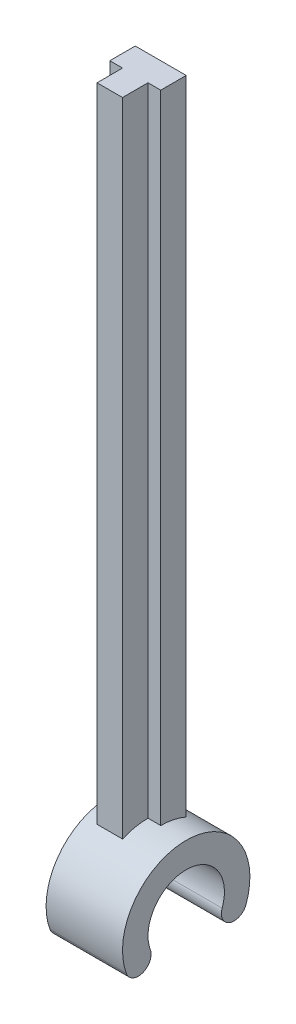
ISO-10303-21;
HEADER;
FILE_DESCRIPTION(('STEP AP214'),'2;1');
FILE_NAME('part.step','',(''),(''),'','','');
FILE_SCHEMA(('AUTOMOTIVE_DESIGN { 1 0 10303 214 1 1 1 1 }'));
ENDSEC;
DATA;
#1=APPLICATION_CONTEXT('core data for automotive mechanical design processes');
#2=APPLICATION_PROTOCOL_DEFINITION('international standard','automotive_design',2000,#1);
#3=PRODUCT_CONTEXT('',#1,'mechanical');
#4=PRODUCT('Part','Part','',(#3));
#5=PRODUCT_RELATED_PRODUCT_CATEGORY('part','',(#4));
#6=PRODUCT_DEFINITION_FORMATION('','',#4);
#7=PRODUCT_DEFINITION_CONTEXT('part definition',#1,'design');
#8=PRODUCT_DEFINITION('design','',#6,#7);
#9=PRODUCT_DEFINITION_SHAPE('','',#8);
#10=(LENGTH_UNIT() NAMED_UNIT(*) SI_UNIT(.MILLI.,.METRE.));
#11=(NAMED_UNIT(*) PLANE_ANGLE_UNIT() SI_UNIT($,.RADIAN.));
#12=(NAMED_UNIT(*) SI_UNIT($,.STERADIAN.) SOLID_ANGLE_UNIT());
#13=UNCERTAINTY_MEASURE_WITH_UNIT(LENGTH_MEASURE(1.E-05),#10,'distance_accuracy_value','');
#14=(GEOMETRIC_REPRESENTATION_CONTEXT(3) GLOBAL_UNCERTAINTY_ASSIGNED_CONTEXT((#13)) GLOBAL_UNIT_ASSIGNED_CONTEXT((#10,
#11,#12)) REPRESENTATION_CONTEXT('',''));
#15=CARTESIAN_POINT('',(0.,0.,0.));
#16=DIRECTION('',(0.,0.,1.));
#17=DIRECTION('',(1.,0.,0.));
#18=AXIS2_PLACEMENT_3D('',#15,#16,#17);
#19=CARTESIAN_POINT('',(4.,0.,0.));
#20=DIRECTION('',(-1.,0.,0.));
#21=DIRECTION('',(0.,0.,1.));
#22=AXIS2_PLACEMENT_3D('',#19,#20,#21);
#23=CYLINDRICAL_SURFACE('',#22,5.);
#24=CARTESIAN_POINT('',(-1.,0.,0.));
#25=DIRECTION('',(1.,0.,0.));
#26=DIRECTION('',(0.,0.,-1.));
#27=AXIS2_PLACEMENT_3D('',#24,#25,#26);
#28=CIRCLE('',#27,5.);
#29=CARTESIAN_POINT('',(-1.,5.,0.));
#30=VERTEX_POINT('',#29);
#31=CARTESIAN_POINT('',(-1.,4.58257569495584,2.));
#32=VERTEX_POINT('',#31);
#33=EDGE_CURVE('E169',#30,#32,#28,.T.);
#34=ORIENTED_EDGE('',*,*,#33,.F.);
#35=DIRECTION('',(-1.,0.,0.));
#36=VECTOR('',#35,1.);
#37=CARTESIAN_POINT('',(4.,5.,0.));
#38=LINE('',#37,#36);
#39=CARTESIAN_POINT('',(-2.,5.,0.));
#40=VERTEX_POINT('',#39);
#41=EDGE_CURVE('E204',#30,#40,#38,.T.);
#42=ORIENTED_EDGE('',*,*,#41,.T.);
#43=CARTESIAN_POINT('',(-2.,0.,0.));
#44=DIRECTION('',(1.,0.,0.));
#45=DIRECTION('',(0.,0.,-1.));
#46=AXIS2_PLACEMENT_3D('',#43,#44,#45);
#47=CIRCLE('',#46,5.);
#48=CARTESIAN_POINT('',(-2.,-1.71010071662835,4.69846310392954));
#49=VERTEX_POINT('',#48);
#50=EDGE_CURVE('E216',#40,#49,#47,.T.);
#51=ORIENTED_EDGE('',*,*,#50,.T.);
#52=DIRECTION('',(-1.,0.,0.));
#53=VECTOR('',#52,1.);
#54=CARTESIAN_POINT('',(4.,-1.71010071662835,4.69846310392954));
#55=LINE('',#54,#53);
#56=CARTESIAN_POINT('',(4.,-1.71010071662835,4.69846310392954));
#57=VERTEX_POINT('',#56);
#58=EDGE_CURVE('E243',#57,#49,#55,.T.);
#59=ORIENTED_EDGE('',*,*,#58,.F.);
#60=CARTESIAN_POINT('',(4.,0.,0.));
#61=DIRECTION('',(1.,0.,0.));
#62=DIRECTION('',(0.,0.,-1.));
#63=AXIS2_PLACEMENT_3D('',#60,#61,#62);
#64=CIRCLE('',#63,5.);
#65=CARTESIAN_POINT('',(4.,-1.71010071662835,-4.69846310392954));
#66=VERTEX_POINT('',#65);
#67=EDGE_CURVE('E233',#66,#57,#64,.T.);
#68=ORIENTED_EDGE('',*,*,#67,.F.);
#69=DIRECTION('',(-1.,0.,0.));
#70=VECTOR('',#69,1.);
#71=CARTESIAN_POINT('',(4.,-1.71010071662835,-4.69846310392954));
#72=LINE('',#71,#70);
#73=CARTESIAN_POINT('',(-2.,-1.71010071662835,-4.69846310392954));
#74=VERTEX_POINT('',#73);
#75=EDGE_CURVE('E247',#66,#74,#72,.T.);
#76=ORIENTED_EDGE('',*,*,#75,.T.);
#77=CARTESIAN_POINT('',(-2.,4.58257569495584,-2.));
#78=VERTEX_POINT('',#77);
#79=EDGE_CURVE('E217',#74,#78,#47,.T.);
#80=ORIENTED_EDGE('',*,*,#79,.T.);
#81=DIRECTION('',(-1.,0.,0.));
#82=VECTOR('',#81,1.);
#83=CARTESIAN_POINT('',(4.,4.58257569495584,-2.));
#84=LINE('',#83,#82);
#85=CARTESIAN_POINT('',(2.,4.58257569495584,-2.));
#86=VERTEX_POINT('',#85);
#87=EDGE_CURVE('E196',#78,#86,#84,.F.);
#88=ORIENTED_EDGE('',*,*,#87,.T.);
#89=CARTESIAN_POINT('',(2.,0.,0.));
#90=DIRECTION('',(1.,0.,0.));
#91=DIRECTION('',(0.,0.,-1.));
#92=AXIS2_PLACEMENT_3D('',#89,#90,#91);
#93=CIRCLE('',#92,5.);
#94=CARTESIAN_POINT('',(2.,5.,0.));
#95=VERTEX_POINT('',#94);
#96=EDGE_CURVE('E52',#86,#95,#93,.T.);
#97=ORIENTED_EDGE('',*,*,#96,.T.);
#98=CARTESIAN_POINT('',(1.,5.,0.));
#99=VERTEX_POINT('',#98);
#100=EDGE_CURVE('E205',#95,#99,#38,.T.);
#101=ORIENTED_EDGE('',*,*,#100,.T.);
#102=CARTESIAN_POINT('',(1.,0.,0.));
#103=DIRECTION('',(1.,0.,0.));
#104=DIRECTION('',(0.,0.,-1.));
#105=AXIS2_PLACEMENT_3D('',#102,#103,#104);
#106=CIRCLE('',#105,5.);
#107=CARTESIAN_POINT('',(1.,4.58257569495584,2.));
#108=VERTEX_POINT('',#107);
#109=EDGE_CURVE('E141',#99,#108,#106,.T.);
#110=ORIENTED_EDGE('',*,*,#109,.T.);
#111=DIRECTION('',(-1.,0.,0.));
#112=VECTOR('',#111,1.);
#113=CARTESIAN_POINT('',(4.,4.58257569495584,2.));
#114=LINE('',#113,#112);
#115=EDGE_CURVE('E11',#108,#32,#114,.T.);
#116=ORIENTED_EDGE('',*,*,#115,.T.);
#117=EDGE_LOOP('',(#34,#42,#51,#59,#68,#76,#80,#88,#97,#101,#110,#116));
#118=FACE_BOUND('',#117,.T.);
#119=ADVANCED_FACE('F43',(#118),#23,.T.);
#120=CARTESIAN_POINT('',(-2.,0.,0.));
#121=DIRECTION('',(0.,0.,1.));
#122=DIRECTION('',(0.,-1.,0.));
#123=AXIS2_PLACEMENT_3D('',#120,#121,#122);
#124=PLANE('',#123);
#125=ORIENTED_EDGE('',*,*,#41,.F.);
#126=DIRECTION('',(0.,1.,0.));
#127=VECTOR('',#126,1.);
#128=CARTESIAN_POINT('',(-1.,3.,0.));
#129=LINE('',#128,#127);
#130=CARTESIAN_POINT('',(-1.,55.,0.));
#131=VERTEX_POINT('',#130);
#132=EDGE_CURVE('E156',#30,#131,#129,.T.);
#133=ORIENTED_EDGE('',*,*,#132,.T.);
#134=DIRECTION('',(1.,0.,0.));
#135=VECTOR('',#134,1.);
#136=CARTESIAN_POINT('',(-2.,55.,0.));
#137=LINE('',#136,#135);
#138=CARTESIAN_POINT('',(-2.,55.,0.));
#139=VERTEX_POINT('',#138);
#140=EDGE_CURVE('E193',#139,#131,#137,.T.);
#141=ORIENTED_EDGE('',*,*,#140,.F.);
#142=DIRECTION('',(0.,-1.,0.));
#143=VECTOR('',#142,1.);
#144=CARTESIAN_POINT('',(-2.,0.,0.));
#145=LINE('',#144,#143);
#146=EDGE_CURVE('E188',#139,#40,#145,.T.);
#147=ORIENTED_EDGE('',*,*,#146,.T.);
#148=EDGE_LOOP('',(#125,#133,#141,#147));
#149=FACE_BOUND('',#148,.T.);
#150=ADVANCED_FACE('F270',(#149),#124,.T.);
#151=CARTESIAN_POINT('',(4.,0.,0.));
#152=DIRECTION('',(-1.,0.,0.));
#153=DIRECTION('',(0.,0.,1.));
#154=AXIS2_PLACEMENT_3D('',#151,#152,#153);
#155=CYLINDRICAL_SURFACE('',#154,3.);
#156=DIRECTION('',(-1.,0.,0.));
#157=VECTOR('',#156,1.);
#158=CARTESIAN_POINT('',(4.,-1.02606042997701,2.81907786235773));
#159=LINE('',#158,#157);
#160=CARTESIAN_POINT('',(4.,-1.02606042997701,2.81907786235773));
#161=VERTEX_POINT('',#160);
#162=CARTESIAN_POINT('',(-2.,-1.02606042997701,2.81907786235773));
#163=VERTEX_POINT('',#162);
#164=EDGE_CURVE('E239',#161,#163,#159,.T.);
#165=ORIENTED_EDGE('',*,*,#164,.T.);
#166=CARTESIAN_POINT('',(-2.,0.,0.));
#167=DIRECTION('',(1.,0.,0.));
#168=DIRECTION('',(0.,0.,-1.));
#169=AXIS2_PLACEMENT_3D('',#166,#167,#168);
#170=CIRCLE('',#169,3.);
#171=CARTESIAN_POINT('',(-2.,-1.02606042997701,-2.81907786235773));
#172=VERTEX_POINT('',#171);
#173=EDGE_CURVE('E209',#172,#163,#170,.T.);
#174=ORIENTED_EDGE('',*,*,#173,.F.);
#175=DIRECTION('',(-1.,0.,0.));
#176=VECTOR('',#175,1.);
#177=CARTESIAN_POINT('',(4.,-1.02606042997701,-2.81907786235773));
#178=LINE('',#177,#176);
#179=CARTESIAN_POINT('',(4.,-1.02606042997701,-2.81907786235773));
#180=VERTEX_POINT('',#179);
#181=EDGE_CURVE('E250',#180,#172,#178,.T.);
#182=ORIENTED_EDGE('',*,*,#181,.F.);
#183=CARTESIAN_POINT('',(4.,0.,0.));
#184=DIRECTION('',(1.,0.,0.));
#185=DIRECTION('',(0.,0.,-1.));
#186=AXIS2_PLACEMENT_3D('',#183,#184,#185);
#187=CIRCLE('',#186,3.);
#188=EDGE_CURVE('E225',#180,#161,#187,.T.);
#189=ORIENTED_EDGE('',*,*,#188,.T.);
#190=EDGE_LOOP('',(#165,#174,#182,#189));
#191=FACE_BOUND('',#190,.T.);
#192=ADVANCED_FACE('F45',(#191),#155,.F.);
#193=CARTESIAN_POINT('',(4.,-1.36808057330268,-3.75877048314363));
#194=DIRECTION('',(-1.,0.,0.));
#195=DIRECTION('',(0.,0.,1.));
#196=AXIS2_PLACEMENT_3D('',#193,#194,#195);
#197=CYLINDRICAL_SURFACE('',#196,1.);
#198=ORIENTED_EDGE('',*,*,#181,.T.);
#199=CARTESIAN_POINT('',(-2.,-1.36808057330268,-3.75877048314363));
#200=DIRECTION('',(1.,0.,0.));
#201=DIRECTION('',(0.,0.,-1.));
#202=AXIS2_PLACEMENT_3D('',#199,#200,#201);
#203=CIRCLE('',#202,1.);
#204=EDGE_CURVE('E212',#74,#172,#203,.F.);
#205=ORIENTED_EDGE('',*,*,#204,.F.);
#206=ORIENTED_EDGE('',*,*,#75,.F.);
#207=CARTESIAN_POINT('',(4.,-1.36808057330268,-3.75877048314363));
#208=DIRECTION('',(1.,0.,0.));
#209=DIRECTION('',(0.,0.,-1.));
#210=AXIS2_PLACEMENT_3D('',#207,#208,#209);
#211=CIRCLE('',#210,1.);
#212=EDGE_CURVE('E229',#66,#180,#211,.F.);
#213=ORIENTED_EDGE('',*,*,#212,.T.);
#214=EDGE_LOOP('',(#198,#205,#206,#213));
#215=FACE_BOUND('',#214,.T.);
#216=ADVANCED_FACE('F290',(#215),#197,.T.);
#217=CARTESIAN_POINT('',(4.,-1.36808057330268,3.75877048314363));
#218=DIRECTION('',(-1.,0.,0.));
#219=DIRECTION('',(0.,0.,1.));
#220=AXIS2_PLACEMENT_3D('',#217,#218,#219);
#221=CYLINDRICAL_SURFACE('',#220,1.);
#222=ORIENTED_EDGE('',*,*,#58,.T.);
#223=CARTESIAN_POINT('',(-2.,-1.36808057330268,3.75877048314363));
#224=DIRECTION('',(1.,0.,0.));
#225=DIRECTION('',(0.,0.,-1.));
#226=AXIS2_PLACEMENT_3D('',#223,#224,#225);
#227=CIRCLE('',#226,1.);
#228=EDGE_CURVE('E221',#49,#163,#227,.T.);
#229=ORIENTED_EDGE('',*,*,#228,.T.);
#230=ORIENTED_EDGE('',*,*,#164,.F.);
#231=CARTESIAN_POINT('',(4.,-1.36808057330268,3.75877048314363));
#232=DIRECTION('',(1.,0.,0.));
#233=DIRECTION('',(0.,0.,-1.));
#234=AXIS2_PLACEMENT_3D('',#231,#232,#233);
#235=CIRCLE('',#234,1.);
#236=EDGE_CURVE('E236',#57,#161,#235,.T.);
#237=ORIENTED_EDGE('',*,*,#236,.F.);
#238=EDGE_LOOP('',(#222,#229,#230,#237));
#239=FACE_BOUND('',#238,.T.);
#240=ADVANCED_FACE('F288',(#239),#221,.T.);
#241=CARTESIAN_POINT('',(4.,0.,0.));
#242=DIRECTION('',(1.,0.,0.));
#243=DIRECTION('',(0.,0.,-1.));
#244=AXIS2_PLACEMENT_3D('',#241,#242,#243);
#245=PLANE('',#244);
#246=ORIENTED_EDGE('',*,*,#188,.F.);
#247=ORIENTED_EDGE('',*,*,#212,.F.);
#248=ORIENTED_EDGE('',*,*,#67,.T.);
#249=ORIENTED_EDGE('',*,*,#236,.T.);
#250=EDGE_LOOP('',(#246,#247,#248,#249));
#251=FACE_BOUND('',#250,.T.);
#252=ADVANCED_FACE('F276',(#251),#245,.T.);
#253=CARTESIAN_POINT('',(-2.,0.,0.));
#254=DIRECTION('',(1.,0.,0.));
#255=DIRECTION('',(0.,0.,-1.));
#256=AXIS2_PLACEMENT_3D('',#253,#254,#255);
#257=PLANE('',#256);
#258=ORIENTED_EDGE('',*,*,#173,.T.);
#259=ORIENTED_EDGE('',*,*,#228,.F.);
#260=ORIENTED_EDGE('',*,*,#50,.F.);
#261=ORIENTED_EDGE('',*,*,#146,.F.);
#262=DIRECTION('',(0.,0.,-1.));
#263=VECTOR('',#262,1.);
#264=CARTESIAN_POINT('',(-2.,55.,0.));
#265=LINE('',#264,#263);
#266=CARTESIAN_POINT('',(-2.,55.,-2.));
#267=VERTEX_POINT('',#266);
#268=EDGE_CURVE('E184',#139,#267,#265,.T.);
#269=ORIENTED_EDGE('',*,*,#268,.T.);
#270=DIRECTION('',(0.,1.,0.));
#271=VECTOR('',#270,1.);
#272=CARTESIAN_POINT('',(-2.,0.,-2.));
#273=LINE('',#272,#271);
#274=EDGE_CURVE('E181',#78,#267,#273,.T.);
#275=ORIENTED_EDGE('',*,*,#274,.F.);
#276=ORIENTED_EDGE('',*,*,#79,.F.);
#277=ORIENTED_EDGE('',*,*,#204,.T.);
#278=EDGE_LOOP('',(#258,#259,#260,#261,#269,#275,#276,#277));
#279=FACE_BOUND('',#278,.T.);
#280=ADVANCED_FACE('F268',(#279),#257,.F.);
#281=DIRECTION('',(0.,1.,0.));
#282=VECTOR('',#281,1.);
#283=CARTESIAN_POINT('',(1.,3.,0.));
#284=LINE('',#283,#282);
#285=CARTESIAN_POINT('',(1.,55.,0.));
#286=VERTEX_POINT('',#285);
#287=EDGE_CURVE('E150',#99,#286,#284,.T.);
#288=ORIENTED_EDGE('',*,*,#287,.F.);
#289=ORIENTED_EDGE('',*,*,#100,.F.);
#290=DIRECTION('',(0.,-1.,0.));
#291=VECTOR('',#290,1.);
#292=CARTESIAN_POINT('',(2.,0.,0.));
#293=LINE('',#292,#291);
#294=CARTESIAN_POINT('',(2.,55.,0.));
#295=VERTEX_POINT('',#294);
#296=EDGE_CURVE('E67',#295,#95,#293,.T.);
#297=ORIENTED_EDGE('',*,*,#296,.F.);
#298=EDGE_CURVE('E197',#286,#295,#137,.T.);
#299=ORIENTED_EDGE('',*,*,#298,.F.);
#300=EDGE_LOOP('',(#288,#289,#297,#299));
#301=FACE_BOUND('',#300,.T.);
#302=ADVANCED_FACE('F265',(#301),#124,.T.);
#303=CARTESIAN_POINT('',(-2.,0.,-2.));
#304=DIRECTION('',(0.,0.,-1.));
#305=DIRECTION('',(-1.,0.,0.));
#306=AXIS2_PLACEMENT_3D('',#303,#304,#305);
#307=PLANE('',#306);
#308=ORIENTED_EDGE('',*,*,#87,.F.);
#309=ORIENTED_EDGE('',*,*,#274,.T.);
#310=DIRECTION('',(1.,0.,0.));
#311=VECTOR('',#310,1.);
#312=CARTESIAN_POINT('',(-2.,55.,-2.));
#313=LINE('',#312,#311);
#314=CARTESIAN_POINT('',(2.,55.,-2.));
#315=VERTEX_POINT('',#314);
#316=EDGE_CURVE('E192',#267,#315,#313,.T.);
#317=ORIENTED_EDGE('',*,*,#316,.T.);
#318=DIRECTION('',(0.,1.,0.));
#319=VECTOR('',#318,1.);
#320=CARTESIAN_POINT('',(2.,0.,-2.));
#321=LINE('',#320,#319);
#322=EDGE_CURVE('E172',#86,#315,#321,.T.);
#323=ORIENTED_EDGE('',*,*,#322,.F.);
#324=EDGE_LOOP('',(#308,#309,#317,#323));
#325=FACE_BOUND('',#324,.T.);
#326=ADVANCED_FACE('F259',(#325),#307,.T.);
#327=CARTESIAN_POINT('',(-2.,55.,0.));
#328=DIRECTION('',(0.,-1.,0.));
#329=DIRECTION('',(0.,0.,-1.));
#330=AXIS2_PLACEMENT_3D('',#327,#328,#329);
#331=PLANE('',#330);
#332=ORIENTED_EDGE('',*,*,#140,.T.);
#333=DIRECTION('',(0.,0.,1.));
#334=VECTOR('',#333,1.);
#335=CARTESIAN_POINT('',(-1.,55.,0.));
#336=LINE('',#335,#334);
#337=CARTESIAN_POINT('',(-1.,55.,2.));
#338=VERTEX_POINT('',#337);
#339=EDGE_CURVE('E135',#131,#338,#336,.T.);
#340=ORIENTED_EDGE('',*,*,#339,.T.);
#341=DIRECTION('',(1.,0.,0.));
#342=VECTOR('',#341,1.);
#343=CARTESIAN_POINT('',(-1.,55.,2.));
#344=LINE('',#343,#342);
#345=CARTESIAN_POINT('',(1.,55.,2.));
#346=VERTEX_POINT('',#345);
#347=EDGE_CURVE('E132',#338,#346,#344,.T.);
#348=ORIENTED_EDGE('',*,*,#347,.T.);
#349=DIRECTION('',(0.,0.,1.));
#350=VECTOR('',#349,1.);
#351=CARTESIAN_POINT('',(1.,55.,0.));
#352=LINE('',#351,#350);
#353=EDGE_CURVE('E59',#286,#346,#352,.T.);
#354=ORIENTED_EDGE('',*,*,#353,.F.);
#355=ORIENTED_EDGE('',*,*,#298,.T.);
#356=DIRECTION('',(0.,0.,-1.));
#357=VECTOR('',#356,1.);
#358=CARTESIAN_POINT('',(2.,55.,0.));
#359=LINE('',#358,#357);
#360=EDGE_CURVE('E175',#295,#315,#359,.T.);
#361=ORIENTED_EDGE('',*,*,#360,.T.);
#362=ORIENTED_EDGE('',*,*,#316,.F.);
#363=ORIENTED_EDGE('',*,*,#268,.F.);
#364=EDGE_LOOP('',(#332,#340,#348,#354,#355,#361,#362,#363));
#365=FACE_BOUND('',#364,.T.);
#366=ADVANCED_FACE('F134',(#365),#331,.F.);
#367=CARTESIAN_POINT('',(2.,0.,0.));
#368=DIRECTION('',(1.,0.,0.));
#369=DIRECTION('',(0.,0.,-1.));
#370=AXIS2_PLACEMENT_3D('',#367,#368,#369);
#371=PLANE('',#370);
#372=ORIENTED_EDGE('',*,*,#96,.F.);
#373=ORIENTED_EDGE('',*,*,#322,.T.);
#374=ORIENTED_EDGE('',*,*,#360,.F.);
#375=ORIENTED_EDGE('',*,*,#296,.T.);
#376=EDGE_LOOP('',(#372,#373,#374,#375));
#377=FACE_BOUND('',#376,.T.);
#378=ADVANCED_FACE('F257',(#377),#371,.T.);
#379=CARTESIAN_POINT('',(-1.,3.00000000000001,2.));
#380=DIRECTION('',(0.,0.,1.));
#381=DIRECTION('',(1.,0.,0.));
#382=AXIS2_PLACEMENT_3D('',#379,#380,#381);
#383=PLANE('',#382);
#384=ORIENTED_EDGE('',*,*,#115,.F.);
#385=DIRECTION('',(0.,-1.,0.));
#386=VECTOR('',#385,1.);
#387=CARTESIAN_POINT('',(1.,3.00000000000001,2.));
#388=LINE('',#387,#386);
#389=EDGE_CURVE('E147',#346,#108,#388,.T.);
#390=ORIENTED_EDGE('',*,*,#389,.F.);
#391=ORIENTED_EDGE('',*,*,#347,.F.);
#392=DIRECTION('',(0.,-1.,0.));
#393=VECTOR('',#392,1.);
#394=CARTESIAN_POINT('',(-1.,3.00000000000001,2.));
#395=LINE('',#394,#393);
#396=EDGE_CURVE('E142',#338,#32,#395,.T.);
#397=ORIENTED_EDGE('',*,*,#396,.T.);
#398=EDGE_LOOP('',(#384,#390,#391,#397));
#399=FACE_BOUND('',#398,.T.);
#400=ADVANCED_FACE('F154',(#399),#383,.T.);
#401=CARTESIAN_POINT('',(-1.,0.,0.));
#402=DIRECTION('',(1.,0.,0.));
#403=DIRECTION('',(0.,0.,-1.));
#404=AXIS2_PLACEMENT_3D('',#401,#402,#403);
#405=PLANE('',#404);
#406=ORIENTED_EDGE('',*,*,#132,.F.);
#407=ORIENTED_EDGE('',*,*,#33,.T.);
#408=ORIENTED_EDGE('',*,*,#396,.F.);
#409=ORIENTED_EDGE('',*,*,#339,.F.);
#410=EDGE_LOOP('',(#406,#407,#408,#409));
#411=FACE_BOUND('',#410,.T.);
#412=ADVANCED_FACE('F325',(#411),#405,.F.);
#413=CARTESIAN_POINT('',(1.,0.,0.));
#414=DIRECTION('',(1.,0.,0.));
#415=DIRECTION('',(0.,0.,-1.));
#416=AXIS2_PLACEMENT_3D('',#413,#414,#415);
#417=PLANE('',#416);
#418=ORIENTED_EDGE('',*,*,#109,.F.);
#419=ORIENTED_EDGE('',*,*,#287,.T.);
#420=ORIENTED_EDGE('',*,*,#353,.T.);
#421=ORIENTED_EDGE('',*,*,#389,.T.);
#422=EDGE_LOOP('',(#418,#419,#420,#421));
#423=FACE_BOUND('',#422,.T.);
#424=ADVANCED_FACE('F146',(#423),#417,.T.);
#425=CLOSED_SHELL('',(#119,#150,#192,#216,#240,#252,#280,#302,#326,#366,#378,#400,#412,#424));
#426=MANIFOLD_SOLID_BREP('B2',#425);
#427=ADVANCED_BREP_SHAPE_REPRESENTATION('',(#18,#426),#14);
#428=SHAPE_DEFINITION_REPRESENTATION(#9,#427);
ENDSEC;
END-ISO-10303-21;
